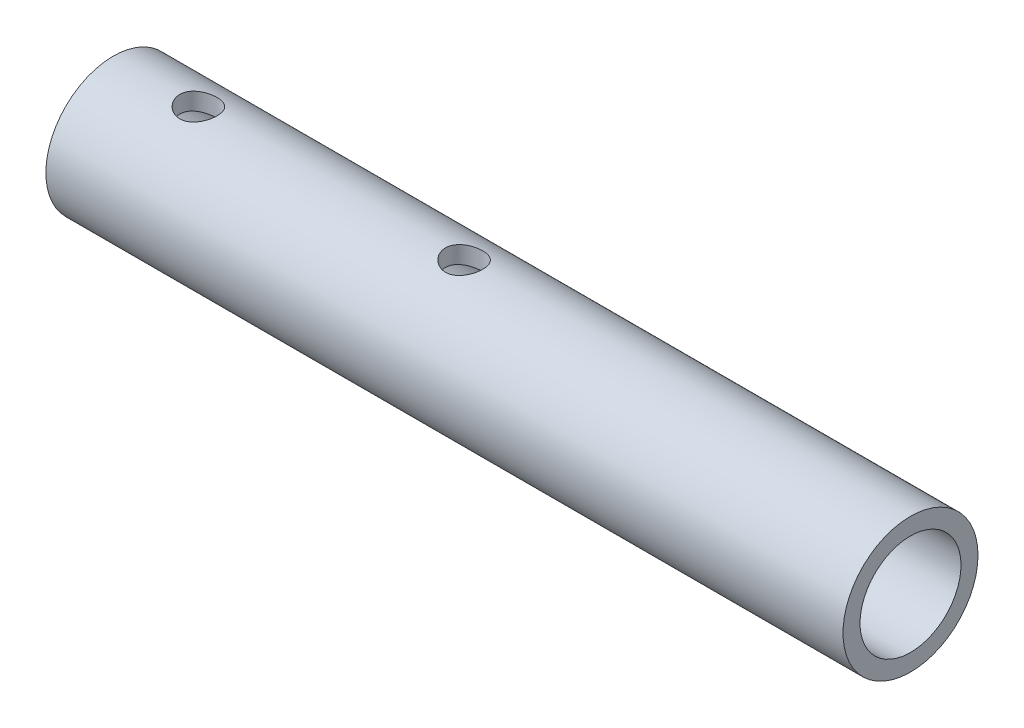
ISO-10303-21;
HEADER;
FILE_DESCRIPTION(('STEP AP214'),'2;1');
FILE_NAME('part.step','',(''),(''),'','','');
FILE_SCHEMA(('AUTOMOTIVE_DESIGN { 1 0 10303 214 1 1 1 1 }'));
ENDSEC;
DATA;
#1=APPLICATION_CONTEXT('core data for automotive mechanical design processes');
#2=APPLICATION_PROTOCOL_DEFINITION('international standard','automotive_design',2000,#1);
#3=PRODUCT_CONTEXT('',#1,'mechanical');
#4=PRODUCT('Part','Part','',(#3));
#5=PRODUCT_RELATED_PRODUCT_CATEGORY('part','',(#4));
#6=PRODUCT_DEFINITION_FORMATION('','',#4);
#7=PRODUCT_DEFINITION_CONTEXT('part definition',#1,'design');
#8=PRODUCT_DEFINITION('design','',#6,#7);
#9=PRODUCT_DEFINITION_SHAPE('','',#8);
#10=(LENGTH_UNIT() NAMED_UNIT(*) SI_UNIT(.MILLI.,.METRE.));
#11=(NAMED_UNIT(*) PLANE_ANGLE_UNIT() SI_UNIT($,.RADIAN.));
#12=(NAMED_UNIT(*) SI_UNIT($,.STERADIAN.) SOLID_ANGLE_UNIT());
#13=UNCERTAINTY_MEASURE_WITH_UNIT(LENGTH_MEASURE(1.E-05),#10,'distance_accuracy_value','');
#14=(GEOMETRIC_REPRESENTATION_CONTEXT(3) GLOBAL_UNCERTAINTY_ASSIGNED_CONTEXT((#13)) GLOBAL_UNIT_ASSIGNED_CONTEXT((#10,
#11,#12)) REPRESENTATION_CONTEXT('',''));
#15=CARTESIAN_POINT('',(0.,0.,0.));
#16=DIRECTION('',(0.,0.,1.));
#17=DIRECTION('',(1.,0.,0.));
#18=AXIS2_PLACEMENT_3D('',#15,#16,#17);
#19=CARTESIAN_POINT('',(75.,0.,0.));
#20=DIRECTION('',(1.,0.,0.));
#21=DIRECTION('',(0.,0.,-1.));
#22=AXIS2_PLACEMENT_3D('',#19,#20,#21);
#23=PLANE('',#22);
#24=CARTESIAN_POINT('',(75.,0.,0.));
#25=DIRECTION('',(1.,0.,0.));
#26=DIRECTION('',(0.,0.,-1.));
#27=AXIS2_PLACEMENT_3D('',#24,#25,#26);
#28=CIRCLE('',#27,6.35);
#29=CARTESIAN_POINT('',(75.,0.,-6.35000000000001));
#30=VERTEX_POINT('',#29);
#31=EDGE_CURVE('E10',#30,#30,#28,.T.);
#32=ORIENTED_EDGE('',*,*,#31,.T.);
#33=EDGE_LOOP('',(#32));
#34=FACE_BOUND('',#33,.T.);
#35=CARTESIAN_POINT('',(75.,0.,0.));
#36=DIRECTION('',(1.,0.,0.));
#37=DIRECTION('',(0.,0.,-1.));
#38=AXIS2_PLACEMENT_3D('',#35,#36,#37);
#39=CIRCLE('',#38,4.75);
#40=CARTESIAN_POINT('',(75.,0.,-4.75));
#41=VERTEX_POINT('',#40);
#42=EDGE_CURVE('E57',#41,#41,#39,.T.);
#43=ORIENTED_EDGE('',*,*,#42,.F.);
#44=EDGE_LOOP('',(#43));
#45=FACE_BOUND('',#44,.T.);
#46=ADVANCED_FACE('F41',(#34,#45),#23,.T.);
#47=CARTESIAN_POINT('',(0.,0.,0.));
#48=DIRECTION('',(1.,0.,0.));
#49=DIRECTION('',(0.,0.,-1.));
#50=AXIS2_PLACEMENT_3D('',#47,#48,#49);
#51=PLANE('',#50);
#52=CARTESIAN_POINT('',(0.,0.,0.));
#53=DIRECTION('',(1.,0.,0.));
#54=DIRECTION('',(0.,0.,-1.));
#55=AXIS2_PLACEMENT_3D('',#52,#53,#54);
#56=CIRCLE('',#55,6.35);
#57=CARTESIAN_POINT('',(0.,0.,-6.35000000000001));
#58=VERTEX_POINT('',#57);
#59=EDGE_CURVE('E46',#58,#58,#56,.T.);
#60=ORIENTED_EDGE('',*,*,#59,.F.);
#61=EDGE_LOOP('',(#60));
#62=FACE_BOUND('',#61,.T.);
#63=CARTESIAN_POINT('',(0.,0.,0.));
#64=DIRECTION('',(1.,0.,0.));
#65=DIRECTION('',(0.,0.,-1.));
#66=AXIS2_PLACEMENT_3D('',#63,#64,#65);
#67=CIRCLE('',#66,4.75);
#68=CARTESIAN_POINT('',(0.,0.,-4.75));
#69=VERTEX_POINT('',#68);
#70=EDGE_CURVE('E59',#69,#69,#67,.T.);
#71=ORIENTED_EDGE('',*,*,#70,.T.);
#72=EDGE_LOOP('',(#71));
#73=FACE_BOUND('',#72,.T.);
#74=ADVANCED_FACE('F94',(#62,#73),#51,.F.);
#75=CARTESIAN_POINT('',(75.,0.,0.));
#76=DIRECTION('',(-1.,0.,0.));
#77=DIRECTION('',(0.,0.,1.));
#78=AXIS2_PLACEMENT_3D('',#75,#76,#77);
#79=CYLINDRICAL_SURFACE('',#78,6.35);
#80=CARTESIAN_POINT('',(33.,6.10409698481276,1.75000000000001));
#81=CARTESIAN_POINT('',(32.903726478293,6.10409852189518,1.74999793665342));
#82=CARTESIAN_POINT('',(32.8074316060573,6.10639952563711,1.74202843331518));
#83=CARTESIAN_POINT('',(32.617631683193,6.11532507468688,1.71042689381995));
#84=CARTESIAN_POINT('',(32.5241279295562,6.121951598274,1.6867876910392));
#85=CARTESIAN_POINT('',(32.3426837176868,6.1387219498062,1.62468995100829));
#86=CARTESIAN_POINT('',(32.2547352945834,6.14886060043192,1.58625321795287));
#87=CARTESIAN_POINT('',(32.0865192465432,6.17150613503344,1.49572074421094));
#88=CARTESIAN_POINT('',(32.0062523664603,6.18401324832167,1.44362368075554));
#89=CARTESIAN_POINT('',(31.8535340796171,6.21036089584916,1.32576094494732));
#90=CARTESIAN_POINT('',(31.7813182217827,6.2242263372627,1.25969556769557));
#91=CARTESIAN_POINT('',(31.6488382082894,6.25151396033315,1.11641554637069));
#92=CARTESIAN_POINT('',(31.5885753639193,6.26493609322304,1.03919968065257));
#93=CARTESIAN_POINT('',(31.4807193949046,6.29010401576661,0.874166333287331));
#94=CARTESIAN_POINT('',(31.4333619873363,6.30181700590168,0.786189363698174));
#95=CARTESIAN_POINT('',(31.3542010867142,6.32196020254954,0.603144648889981));
#96=CARTESIAN_POINT('',(31.3223947850881,6.33039100177892,0.508078187629611));
#97=CARTESIAN_POINT('',(31.2760057043632,6.34284374916729,0.316013263798663));
#98=CARTESIAN_POINT('',(31.2610218764658,6.34696818532804,0.219118428085025));
#99=CARTESIAN_POINT('',(31.2474396764738,6.35070249588322,0.0241083672969177));
#100=CARTESIAN_POINT('',(31.2488383825844,6.35031317529801,-0.0740066370447175));
#101=CARTESIAN_POINT('',(31.2677025140013,6.34513825392006,-0.265874811958899));
#102=CARTESIAN_POINT('',(31.2847343961207,6.34047128681543,-0.359674299718142));
#103=CARTESIAN_POINT('',(31.3336790080619,6.3274065112384,-0.543028361863702));
#104=CARTESIAN_POINT('',(31.3655926141211,6.31900848308215,-0.632582685952297));
#105=CARTESIAN_POINT('',(31.4437169034401,6.29925232107458,-0.805991347951752));
#106=CARTESIAN_POINT('',(31.4900729559153,6.28786428361089,-0.889776646916401));
#107=CARTESIAN_POINT('',(31.5956538750467,6.26335032324547,-1.04852464490997));
#108=CARTESIAN_POINT('',(31.6548813958865,6.25022404212459,-1.12348551936064));
#109=CARTESIAN_POINT('',(31.7868122429779,6.22314469579829,-1.26504502601596));
#110=CARTESIAN_POINT('',(31.8598931643115,6.20917863144767,-1.33128968814417));
#111=CARTESIAN_POINT('',(32.0162698494247,6.18237831460548,-1.4506730103525));
#112=CARTESIAN_POINT('',(32.0995663262577,6.16954414122834,-1.50381075477976));
#113=CARTESIAN_POINT('',(32.2748188698337,6.14640581472612,-1.59576614174717));
#114=CARTESIAN_POINT('',(32.3668312778072,6.13611993035961,-1.63448133042054));
#115=CARTESIAN_POINT('',(32.5564144719339,6.11946654023644,-1.69577395826584));
#116=CARTESIAN_POINT('',(32.6539837633246,6.11309798613388,-1.71835571528702));
#117=CARTESIAN_POINT('',(32.8485853896213,6.10522544847568,-1.74611719743667));
#118=CARTESIAN_POINT('',(32.9455361088604,6.10357319211524,-1.75182754176751));
#119=CARTESIAN_POINT('',(33.1390083844814,6.10491351880639,-1.74715119911437));
#120=CARTESIAN_POINT('',(33.2355299888302,6.10790556891763,-1.73676635907443));
#121=CARTESIAN_POINT('',(33.4233172209264,6.11805354544699,-1.70066353208123));
#122=CARTESIAN_POINT('',(33.5146505149019,6.12512121731996,-1.67527025945891));
#123=CARTESIAN_POINT('',(33.6917600138364,6.14253652049985,-1.61023938700767));
#124=CARTESIAN_POINT('',(33.777535455364,6.15288460126118,-1.57059983517219));
#125=CARTESIAN_POINT('',(33.943298523538,6.17599473084397,-1.4771428108839));
#126=CARTESIAN_POINT('',(34.0231050430238,6.18880734492622,-1.42301691060488));
#127=CARTESIAN_POINT('',(34.1726973354878,6.21528665997305,-1.30250174020575));
#128=CARTESIAN_POINT('',(34.242481086923,6.2289535324418,-1.23611000228319));
#129=CARTESIAN_POINT('',(34.3722797338644,6.25611634637962,-1.09048291702272));
#130=CARTESIAN_POINT('',(34.4319229757604,6.26959372806886,-1.01091213415891));
#131=CARTESIAN_POINT('',(34.5370090491879,6.29442463276488,-0.842582573547962));
#132=CARTESIAN_POINT('',(34.5824526347714,6.30577826853723,-0.753824284023257));
#133=CARTESIAN_POINT('',(34.6574231405609,6.32500931795128,-0.570262414232425));
#134=CARTESIAN_POINT('',(34.6870701281453,6.33291286947596,-0.475510744283153));
#135=CARTESIAN_POINT('',(34.7299458903706,6.34446850347245,-0.282118143585694));
#136=CARTESIAN_POINT('',(34.7431785710197,6.34812159738577,-0.18347814388533));
#137=CARTESIAN_POINT('',(34.7525916563279,6.35071336069495,0.0114291341010378));
#138=CARTESIAN_POINT('',(34.7493155150718,6.34980228396121,0.10766852706502));
#139=CARTESIAN_POINT('',(34.7270753846226,6.34371155924545,0.298171727945037));
#140=CARTESIAN_POINT('',(34.7081120574102,6.33853209138451,0.392435619052808));
#141=CARTESIAN_POINT('',(34.6553512862475,6.32451989199523,0.57561130431485));
#142=CARTESIAN_POINT('',(34.6216707150383,6.31571597422642,0.664559113120028));
#143=CARTESIAN_POINT('',(34.5405355213958,6.29537233269626,0.83559145242125));
#144=CARTESIAN_POINT('',(34.4930788698193,6.28383220595181,0.917674969547773));
#145=CARTESIAN_POINT('',(34.3841853591656,6.25884086005361,1.07515156591088));
#146=CARTESIAN_POINT('',(34.3223930345162,6.24534504091406,1.15029173595953));
#147=CARTESIAN_POINT('',(34.1872475344186,6.21813343781277,1.28931975281782));
#148=CARTESIAN_POINT('',(34.1138912515663,6.20441759562002,1.35320456534951));
#149=CARTESIAN_POINT('',(33.9555890873447,6.1779386391802,1.46942833080971));
#150=CARTESIAN_POINT('',(33.8704078535544,6.16520618208944,1.52145437107517));
#151=CARTESIAN_POINT('',(33.6921670311141,6.14258160774524,1.61037572384607));
#152=CARTESIAN_POINT('',(33.5991123007624,6.13268775525964,1.6472802860082));
#153=CARTESIAN_POINT('',(33.4220930648615,6.11813511573822,1.70045924139317));
#154=CARTESIAN_POINT('',(33.3388465260888,6.11291516228686,1.71899156143149));
#155=CARTESIAN_POINT('',(33.1704053932083,6.10589564386316,1.74376203696688));
#156=CARTESIAN_POINT('',(33.0852110595032,6.10409562435124,1.75000182625448));
#157=CARTESIAN_POINT('',(33.,6.10409698481276,1.75000000000001));
#158=B_SPLINE_CURVE_WITH_KNOTS('',3,(#80,#81,#82,#83,#84,#85,#86,#87,#88,#89,#90,#91,#92,#93,
#94,#95,#96,#97,#98,#99,#100,#101,#102,#103,#104,#105,#106,#107,#108,#109,#110,#111,#112,#113,
#114,#115,#116,#117,#118,#119,#120,#121,#122,#123,#124,#125,#126,#127,#128,#129,#130,#131,#132,
#133,#134,#135,#136,#137,#138,#139,#140,#141,#142,#143,#144,#145,#146,#147,#148,#149,#150,#151,
#152,#153,#154,#155,#156,#157),.UNSPECIFIED.,.T.,.F.,(4,2,2,2,2,2,2,2,2,2,2,2,2,2,2,2,2,2,2,2,2,
2,2,2,2,2,2,2,2,2,2,2,2,2,2,2,2,2,4),(0.,0.2885069858017,0.577146012995166,0.865361347783308,
1.15360460160036,1.44880872771764,1.74404522090432,2.04435917572703,2.34461887297435,
2.63755738646942,2.93044365571319,3.21544518194925,3.5004634912202,3.78844873778186,
4.07649342528813,4.37396520397803,4.67145775824561,4.97102504598991,5.27051212938253,
5.56047420737574,5.85040301429398,6.13427754321484,6.41819098309071,6.7087104475818,
6.99928842637667,7.29891051854349,7.59851669701259,7.89581190287579,8.19303634971137,
8.48054166303009,8.76803484458378,9.05328533417214,9.33857786097758,9.63188947804368,
9.92528004699316,10.2256921942077,10.5259203070039,10.781309884442,11.0366655159628),.UNSPECIFIED.);
#159=CARTESIAN_POINT('',(33.,6.10409698481276,1.75000000000001));
#160=VERTEX_POINT('',#159);
#161=EDGE_CURVE('E111',#160,#160,#158,.T.);
#162=ORIENTED_EDGE('',*,*,#161,.T.);
#163=EDGE_LOOP('',(#162));
#164=FACE_BOUND('',#163,.T.);
#165=CARTESIAN_POINT('',(8.00000000000001,6.10409698481277,1.75000000000001));
#166=CARTESIAN_POINT('',(7.90372647829301,6.10409852189518,1.74999793665341));
#167=CARTESIAN_POINT('',(7.80743160605726,6.1063995256371,1.74202843331517));
#168=CARTESIAN_POINT('',(7.61763168319297,6.11532507468688,1.71042689381994));
#169=CARTESIAN_POINT('',(7.52412792955616,6.12195159827402,1.68678769103919));
#170=CARTESIAN_POINT('',(7.34268371768681,6.13872194980622,1.62468995100828));
#171=CARTESIAN_POINT('',(7.2547352945834,6.14886060043191,1.58625321795286));
#172=CARTESIAN_POINT('',(7.08651924654331,6.17150613503343,1.49572074421096));
#173=CARTESIAN_POINT('',(7.0062523664604,6.18401324832167,1.44362368075558));
#174=CARTESIAN_POINT('',(6.85353407961716,6.21036089584917,1.32576094494737));
#175=CARTESIAN_POINT('',(6.78131822178277,6.22422633726269,1.2596955676956));
#176=CARTESIAN_POINT('',(6.64883820828944,6.25151396033313,1.11641554637071));
#177=CARTESIAN_POINT('',(6.58857536391925,6.26493609322303,1.03919968065262));
#178=CARTESIAN_POINT('',(6.4807193949046,6.29010401576661,0.874166333287401));
#179=CARTESIAN_POINT('',(6.43336198733634,6.30181700590169,0.786189363698244));
#180=CARTESIAN_POINT('',(6.35420108671434,6.32196020254951,0.603144648890037));
#181=CARTESIAN_POINT('',(6.32239478508829,6.33039100177884,0.50807818762965));
#182=CARTESIAN_POINT('',(6.27600570436338,6.34284374916721,0.316013263798687));
#183=CARTESIAN_POINT('',(6.26102187646585,6.34696818532801,0.219118428085048));
#184=CARTESIAN_POINT('',(6.24743967647382,6.35070249588323,0.0241083672969252));
#185=CARTESIAN_POINT('',(6.2488383825844,6.35031317529803,-0.074006637044725));
#186=CARTESIAN_POINT('',(6.26770251400133,6.34513825392006,-0.265874811958916));
#187=CARTESIAN_POINT('',(6.28473439612067,6.34047128681541,-0.359674299718155));
#188=CARTESIAN_POINT('',(6.33367900806193,6.32740651123841,-0.543028361863722));
#189=CARTESIAN_POINT('',(6.36559261412111,6.31900848308222,-0.63258268595233));
#190=CARTESIAN_POINT('',(6.44371690344011,6.29925232107465,-0.805991347951779));
#191=CARTESIAN_POINT('',(6.4900729559154,6.28786428361089,-0.889776646916411));
#192=CARTESIAN_POINT('',(6.59565387504673,6.26335032324546,-1.04852464490997));
#193=CARTESIAN_POINT('',(6.65488139588645,6.25022404212461,-1.12348551936065));
#194=CARTESIAN_POINT('',(6.78681224297786,6.22314469579833,-1.26504502601595));
#195=CARTESIAN_POINT('',(6.85989316431144,6.20917863144766,-1.33128968814415));
#196=CARTESIAN_POINT('',(7.01626984942474,6.18237831460547,-1.45067301035248));
#197=CARTESIAN_POINT('',(7.09956632625769,6.16954414122837,-1.50381075477975));
#198=CARTESIAN_POINT('',(7.27481886983369,6.14640581472616,-1.59576614174718));
#199=CARTESIAN_POINT('',(7.36683127780725,6.1361199303596,-1.63448133042056));
#200=CARTESIAN_POINT('',(7.55641447193397,6.11946654023643,-1.69577395826582));
#201=CARTESIAN_POINT('',(7.65398376332465,6.1130979861339,-1.71835571528696));
#202=CARTESIAN_POINT('',(7.84858538962133,6.1052254484757,-1.74611719743662));
#203=CARTESIAN_POINT('',(7.94553610886044,6.10357319211525,-1.75182754176751));
#204=CARTESIAN_POINT('',(8.13900838448143,6.10491351880637,-1.74715119911436));
#205=CARTESIAN_POINT('',(8.23552998883024,6.1079055689176,-1.73676635907437));
#206=CARTESIAN_POINT('',(8.42331722092642,6.11805354544697,-1.70066353208116));
#207=CARTESIAN_POINT('',(8.51465051490193,6.12512121731996,-1.67527025945887));
#208=CARTESIAN_POINT('',(8.69176001383654,6.14253652049986,-1.61023938700765));
#209=CARTESIAN_POINT('',(8.77753545536409,6.15288460126117,-1.57059983517216));
#210=CARTESIAN_POINT('',(8.94329852353809,6.17599473084396,-1.47714281088387));
#211=CARTESIAN_POINT('',(9.02310504302389,6.18880734492622,-1.42301691060486));
#212=CARTESIAN_POINT('',(9.17269733548783,6.21528665997304,-1.30250174020573));
#213=CARTESIAN_POINT('',(9.24248108692303,6.22895353244175,-1.23611000228315));
#214=CARTESIAN_POINT('',(9.37227973386442,6.25611634637956,-1.09048291702268));
#215=CARTESIAN_POINT('',(9.43192297576042,6.26959372806883,-1.0109121341589));
#216=CARTESIAN_POINT('',(9.53700904918795,6.29442463276489,-0.842582573547969));
#217=CARTESIAN_POINT('',(9.58245263477143,6.30577826853723,-0.753824284023256));
#218=CARTESIAN_POINT('',(9.65742314056088,6.32500931795128,-0.570262414232425));
#219=CARTESIAN_POINT('',(9.68707012814531,6.33291286947595,-0.475510744283163));
#220=CARTESIAN_POINT('',(9.72994589037066,6.34446850347244,-0.282118143585715));
#221=CARTESIAN_POINT('',(9.74317857101969,6.34812159738577,-0.183478143885351));
#222=CARTESIAN_POINT('',(9.75259165632789,6.35071336069495,0.0114291341010138));
#223=CARTESIAN_POINT('',(9.74931551507182,6.3498022839612,0.107668527064995));
#224=CARTESIAN_POINT('',(9.72707538462263,6.34371155924544,0.298171727945011));
#225=CARTESIAN_POINT('',(9.7081120574102,6.33853209138452,0.392435619052785));
#226=CARTESIAN_POINT('',(9.65535128624758,6.32451989199525,0.575611304314837));
#227=CARTESIAN_POINT('',(9.6216707150383,6.31571597422641,0.664559113120023));
#228=CARTESIAN_POINT('',(9.54053552139581,6.29537233269625,0.835591452421258));
#229=CARTESIAN_POINT('',(9.49307886981926,6.28383220595181,0.917674969547785));
#230=CARTESIAN_POINT('',(9.38418535916558,6.2588408600536,1.0751515659109));
#231=CARTESIAN_POINT('',(9.32239303451615,6.24534504091404,1.15029173595956));
#232=CARTESIAN_POINT('',(9.1872475344186,6.21813343781276,1.28931975281785));
#233=CARTESIAN_POINT('',(9.1138912515663,6.20441759562006,1.35320456534952));
#234=CARTESIAN_POINT('',(8.95558908734472,6.17793863918025,1.46942833080971));
#235=CARTESIAN_POINT('',(8.87040785355441,6.16520618208945,1.52145437107519));
#236=CARTESIAN_POINT('',(8.69216703111406,6.14258160774521,1.61037572384607));
#237=CARTESIAN_POINT('',(8.59911230076239,6.1326877552596,1.64728028600818));
#238=CARTESIAN_POINT('',(8.4220930648615,6.11813511573819,1.70045924139315));
#239=CARTESIAN_POINT('',(8.33884652608879,6.11291516228684,1.71899156143149));
#240=CARTESIAN_POINT('',(8.17040539320827,6.10589564386316,1.74376203696688));
#241=CARTESIAN_POINT('',(8.08521105950315,6.10409562435125,1.75000182625448));
#242=CARTESIAN_POINT('',(8.00000000000001,6.10409698481277,1.75000000000001));
#243=B_SPLINE_CURVE_WITH_KNOTS('',3,(#165,#166,#167,#168,#169,#170,#171,#172,#173,#174,#175,
#176,#177,#178,#179,#180,#181,#182,#183,#184,#185,#186,#187,#188,#189,#190,#191,#192,#193,#194,
#195,#196,#197,#198,#199,#200,#201,#202,#203,#204,#205,#206,#207,#208,#209,#210,#211,#212,#213,
#214,#215,#216,#217,#218,#219,#220,#221,#222,#223,#224,#225,#226,#227,#228,#229,#230,#231,#232,
#233,#234,#235,#236,#237,#238,#239,#240,#241,#242),.UNSPECIFIED.,.T.,.F.,(4,2,2,2,2,2,2,2,2,2,2,
2,2,2,2,2,2,2,2,2,2,2,2,2,2,2,2,2,2,2,2,2,2,2,2,2,2,2,4),(0.,0.288506985801706,
0.577146012995171,0.865361347783244,1.15360460160024,1.44880872771756,1.74404522090427,
2.04435917572693,2.34461887297423,2.63755738646936,2.93044365571316,3.21544518194922,
3.5004634912202,3.78844873778182,4.07649342528804,4.37396520397796,4.67145775824557,
4.97102504598988,5.27051212938251,5.56047420737573,5.85040301429397,6.13427754321485,
6.41819098309074,6.70871044758178,6.9992884263766,7.29891051854343,7.59851669701251,
7.8958119028757,8.19303634971128,8.48054166302999,8.76803484458367,9.05328533417207,
9.33857786097756,9.63188947804364,9.92528004699311,10.2256921942077,10.5259203070039,
10.7813098844419,11.0366655159627),.UNSPECIFIED.);
#244=CARTESIAN_POINT('',(8.00000000000001,6.10409698481277,1.75000000000001));
#245=VERTEX_POINT('',#244);
#246=EDGE_CURVE('E63',#245,#245,#243,.T.);
#247=ORIENTED_EDGE('',*,*,#246,.T.);
#248=EDGE_LOOP('',(#247));
#249=FACE_BOUND('',#248,.T.);
#250=ORIENTED_EDGE('',*,*,#31,.F.);
#251=EDGE_LOOP('',(#250));
#252=FACE_BOUND('',#251,.T.);
#253=ORIENTED_EDGE('',*,*,#59,.T.);
#254=EDGE_LOOP('',(#253));
#255=FACE_BOUND('',#254,.T.);
#256=ADVANCED_FACE('F43',(#164,#249,#252,#255),#79,.T.);
#257=CARTESIAN_POINT('',(75.,0.,0.));
#258=DIRECTION('',(-1.,0.,0.));
#259=DIRECTION('',(0.,0.,1.));
#260=AXIS2_PLACEMENT_3D('',#257,#258,#259);
#261=CYLINDRICAL_SURFACE('',#260,4.75);
#262=CARTESIAN_POINT('',(33.,4.41588043316392,1.75000000000001));
#263=CARTESIAN_POINT('',(33.094643704677,4.41587772594442,1.75000296393606));
#264=CARTESIAN_POINT('',(33.1892674735245,4.41895619841335,1.74229659111619));
#265=CARTESIAN_POINT('',(33.3756701626302,4.43085479011937,1.71180900473027));
#266=CARTESIAN_POINT('',(33.4674490875959,4.43967489985515,1.68902781611015));
#267=CARTESIAN_POINT('',(33.6454209864375,4.46192494737435,1.62933325783482));
#268=CARTESIAN_POINT('',(33.7316263900987,4.4753441749924,1.59245269915774));
#269=CARTESIAN_POINT('',(33.8966591662716,4.50526347974244,1.50572194894059));
#270=CARTESIAN_POINT('',(33.9754843986707,4.52176444639289,1.45586801110351));
#271=CARTESIAN_POINT('',(34.1272982749308,4.55687446049117,1.34204573923531));
#272=CARTESIAN_POINT('',(34.1998828145986,4.57554404127524,1.27755695287522));
#273=CARTESIAN_POINT('',(34.3334901386671,4.61238165049267,1.13740091022651));
#274=CARTESIAN_POINT('',(34.3945105654326,4.63054957600739,1.06173138004647));
#275=CARTESIAN_POINT('',(34.5051852210974,4.66505327690858,0.898313025326076));
#276=CARTESIAN_POINT('',(34.5544028062826,4.68130976917125,0.810250250338094));
#277=CARTESIAN_POINT('',(34.6371584176023,4.7094337079724,0.626390609541288));
#278=CARTESIAN_POINT('',(34.6707016783666,4.72130261951942,0.530596338310458));
#279=CARTESIAN_POINT('',(34.7197469784455,4.73888454693962,0.3382395778143));
#280=CARTESIAN_POINT('',(34.7359441571717,4.74483401415565,0.241876359414172));
#281=CARTESIAN_POINT('',(34.7520620258188,4.75075375782532,0.0476281685466092));
#282=CARTESIAN_POINT('',(34.7519878250426,4.75072591118856,-0.0502563165810003));
#283=CARTESIAN_POINT('',(34.7359758419837,4.74484620389748,-0.239796265876197));
#284=CARTESIAN_POINT('',(34.720796170855,4.73927267080137,-0.331525893364509));
#285=CARTESIAN_POINT('',(34.6762758239679,4.72329030859975,-0.511030847963088));
#286=CARTESIAN_POINT('',(34.6469341498645,4.71288113860978,-0.598805895819734));
#287=CARTESIAN_POINT('',(34.5745561630335,4.68807624444386,-0.7694053447307));
#288=CARTESIAN_POINT('',(34.5313291007294,4.67362537818711,-0.85214047007091));
#289=CARTESIAN_POINT('',(34.4325741061395,4.64220642699347,-1.0093851902985));
#290=CARTESIAN_POINT('',(34.3770422837008,4.62523754654742,-1.08389217266942));
#291=CARTESIAN_POINT('',(34.2515731181717,4.58940344009113,-1.22704019410143));
#292=CARTESIAN_POINT('',(34.1809978296398,4.57048524329972,-1.2951096651375));
#293=CARTESIAN_POINT('',(34.0293115808277,4.53366038900359,-1.41865751556405));
#294=CARTESIAN_POINT('',(33.9481981677339,4.51575396839269,-1.47413295533113));
#295=CARTESIAN_POINT('',(33.7755574336054,4.48265316721039,-1.57195807450836));
#296=CARTESIAN_POINT('',(33.6838488018777,4.46752284314863,-1.6140111879521));
#297=CARTESIAN_POINT('',(33.4939480024568,4.44242694807012,-1.681864219358));
#298=CARTESIAN_POINT('',(33.3957593229532,4.43245862352274,-1.70767280411619));
#299=CARTESIAN_POINT('',(33.2013174590567,4.41946049269838,-1.74102675881321));
#300=CARTESIAN_POINT('',(33.1052425297296,4.41608748505332,-1.74947671945547));
#301=CARTESIAN_POINT('',(32.9130092664112,4.41569224070595,-1.75047569083922));
#302=CARTESIAN_POINT('',(32.8168509576645,4.41866849505831,-1.74302847965155));
#303=CARTESIAN_POINT('',(32.6317300702696,4.4302888724583,-1.71326363345396));
#304=CARTESIAN_POINT('',(32.5426386742633,4.43867082898711,-1.69163309014842));
#305=CARTESIAN_POINT('',(32.3693864827957,4.45985091705362,-1.63497340037805));
#306=CARTESIAN_POINT('',(32.2852266799876,4.47264993412953,-1.59994156705177));
#307=CARTESIAN_POINT('',(32.1208014994071,4.50179918472839,-1.51602778156754));
#308=CARTESIAN_POINT('',(32.0407915673201,4.51826229259479,-1.46668564858571));
#309=CARTESIAN_POINT('',(31.8898648561892,4.55269040433568,-1.35604656800244));
#310=CARTESIAN_POINT('',(31.8189513186107,4.57065593984803,-1.2947453783445));
#311=CARTESIAN_POINT('',(31.6837602577161,4.60738492160968,-1.15751528786498));
#312=CARTESIAN_POINT('',(31.6201483764504,4.62613046593703,-1.08092361626653));
#313=CARTESIAN_POINT('',(31.5066065205978,4.66125546454762,-0.917691548906777));
#314=CARTESIAN_POINT('',(31.4566764810694,4.67763493006141,-0.831051200844865));
#315=CARTESIAN_POINT('',(31.3722727640303,4.70615763510813,-0.650312130432781));
#316=CARTESIAN_POINT('',(31.3377360556552,4.71831810388549,-0.556245714925111));
#317=CARTESIAN_POINT('',(31.285161495671,4.73709415356964,-0.363090491647545));
#318=CARTESIAN_POINT('',(31.2671161934978,4.7437122383273,-0.264003973259541));
#319=CARTESIAN_POINT('',(31.2488190038322,4.75042842188178,-0.069648715938656));
#320=CARTESIAN_POINT('',(31.2476199610682,4.75087356536522,0.0255196842809479));
#321=CARTESIAN_POINT('',(31.2606294447133,4.74609027643645,0.214642320081045));
#322=CARTESIAN_POINT('',(31.274836220713,4.74086248858274,0.308596692372172));
#323=CARTESIAN_POINT('',(31.3175935746866,4.72547440695464,0.490446312410128));
#324=CARTESIAN_POINT('',(31.3458084212073,4.71542974291821,0.57843102102063));
#325=CARTESIAN_POINT('',(31.415451002187,4.69145287166495,0.748429740032015));
#326=CARTESIAN_POINT('',(31.4568812322474,4.6775199302456,0.830442619112993));
#327=CARTESIAN_POINT('',(31.5537312028064,4.64645105067488,0.98988051852367));
#328=CARTESIAN_POINT('',(31.6096584867753,4.62920650786024,1.06697569431901));
#329=CARTESIAN_POINT('',(31.7331049043176,4.59364047116218,1.2109825161298));
#330=CARTESIAN_POINT('',(31.8006281143186,4.57531860004972,1.27789056530859));
#331=CARTESIAN_POINT('',(31.9494077499229,4.53853497553211,1.40309505510574));
#332=CARTESIAN_POINT('',(32.0311854973241,4.52011288230366,1.46078598729613));
#333=CARTESIAN_POINT('',(32.2038586143454,4.48627758721275,1.56161880229364));
#334=CARTESIAN_POINT('',(32.2947543284365,4.47086449909348,1.60476013515724));
#335=CARTESIAN_POINT('',(32.4859978711911,4.44465900248473,1.676008488497));
#336=CARTESIAN_POINT('',(32.5865430858467,4.43401318465434,1.70364441331098));
#337=CARTESIAN_POINT('',(32.7914017937357,4.41962745275239,1.74063307895359));
#338=CARTESIAN_POINT('',(32.8957129995382,4.4158834162234,1.74999673406699));
#339=CARTESIAN_POINT('',(33.,4.41588043316392,1.75000000000001));
#340=B_SPLINE_CURVE_WITH_KNOTS('',3,(#262,#263,#264,#265,#266,#267,#268,#269,#270,#271,#272,
#273,#274,#275,#276,#277,#278,#279,#280,#281,#282,#283,#284,#285,#286,#287,#288,#289,#290,#291,
#292,#293,#294,#295,#296,#297,#298,#299,#300,#301,#302,#303,#304,#305,#306,#307,#308,#309,#310,
#311,#312,#313,#314,#315,#316,#317,#318,#319,#320,#321,#322,#323,#324,#325,#326,#327,#328,#329,
#330,#331,#332,#333,#334,#335,#336,#337,#338,#339),.UNSPECIFIED.,.T.,.F.,(4,2,2,2,2,2,2,2,2,2,2,
2,2,2,2,2,2,2,2,2,2,2,2,2,2,2,2,2,2,2,2,2,2,2,2,2,2,2,4),(0.,0.28354312410987,0.567085779011282,
0.849972572572725,1.13294114561641,1.4282423684587,1.72360373126369,2.0286180348184,
2.33353040223502,2.62570494689435,2.91778774726543,3.1959152025583,3.47406226720564,
3.75620666411479,4.03844038863934,4.33666566867959,4.63496048727292,4.9394511253468,
5.24377917328466,5.53179858770447,5.8197495599752,6.09469008353301,6.3696857595865,
6.65475099785579,6.93991753749493,7.24242277391773,7.54492657445749,7.8461800743125,
8.14729740508207,8.43141245384541,8.71549522483433,8.99307613398452,9.27070949275213,
9.55982077145926,9.84903389306843,10.1528520880748,10.456681765468,10.7693020341684,
11.0817355131397),.UNSPECIFIED.);
#341=CARTESIAN_POINT('',(33.,4.41588043316392,1.75000000000001));
#342=VERTEX_POINT('',#341);
#343=EDGE_CURVE('E117',#342,#342,#340,.T.);
#344=ORIENTED_EDGE('',*,*,#343,.T.);
#345=EDGE_LOOP('',(#344));
#346=FACE_BOUND('',#345,.T.);
#347=CARTESIAN_POINT('',(7.99999999999984,4.41588043316392,1.75000000000001));
#348=CARTESIAN_POINT('',(8.09464370467686,4.41587772594442,1.75000296393607));
#349=CARTESIAN_POINT('',(8.18926747352433,4.41895619841334,1.74229659111622));
#350=CARTESIAN_POINT('',(8.37567016263006,4.43085479011935,1.71180900473029));
#351=CARTESIAN_POINT('',(8.46744908759573,4.43967489985513,1.68902781611016));
#352=CARTESIAN_POINT('',(8.6454209864374,4.46192494737434,1.62933325783482));
#353=CARTESIAN_POINT('',(8.73162639009861,4.4753441749924,1.59245269915775));
#354=CARTESIAN_POINT('',(8.89665916627164,4.50526347974242,1.5057219489406));
#355=CARTESIAN_POINT('',(8.97548439867084,4.52176444639286,1.45586801110352));
#356=CARTESIAN_POINT('',(9.12729827493089,4.55687446049114,1.3420457392353));
#357=CARTESIAN_POINT('',(9.19988281459866,4.57554404127523,1.27755695287519));
#358=CARTESIAN_POINT('',(9.3334901386671,4.61238165049268,1.13740091022646));
#359=CARTESIAN_POINT('',(9.39451056543262,4.6305495760074,1.06173138004642));
#360=CARTESIAN_POINT('',(9.50518522109744,4.66505327690859,0.898313025326042));
#361=CARTESIAN_POINT('',(9.55440280628268,4.68130976917125,0.810250250338058));
#362=CARTESIAN_POINT('',(9.63715841760231,4.7094337079724,0.626390609541255));
#363=CARTESIAN_POINT('',(9.67070167836659,4.72130261951942,0.530596338310432));
#364=CARTESIAN_POINT('',(9.71974697844554,4.73888454693963,0.338239577814296));
#365=CARTESIAN_POINT('',(9.73594415717174,4.74483401415567,0.241876359414185));
#366=CARTESIAN_POINT('',(9.75206202581878,4.75075375782529,0.047628168546658));
#367=CARTESIAN_POINT('',(9.7519878250426,4.75072591118847,-0.0502563165809313));
#368=CARTESIAN_POINT('',(9.73597584198373,4.74484620389741,-0.239796265876124));
#369=CARTESIAN_POINT('',(9.72079617085503,4.73927267080135,-0.331525893364451));
#370=CARTESIAN_POINT('',(9.67627582396792,4.72329030859976,-0.511030847963034));
#371=CARTESIAN_POINT('',(9.64693414986443,4.71288113860977,-0.598805895819667));
#372=CARTESIAN_POINT('',(9.5745561630335,4.68807624444384,-0.769405344730644));
#373=CARTESIAN_POINT('',(9.53132910072943,4.6736253781871,-0.852140470070878));
#374=CARTESIAN_POINT('',(9.43257410613959,4.64220642699347,-1.00938519029851));
#375=CARTESIAN_POINT('',(9.37704228370086,4.62523754654742,-1.08389217266944));
#376=CARTESIAN_POINT('',(9.25157311817177,4.58940344009113,-1.22704019410144));
#377=CARTESIAN_POINT('',(9.18099782963986,4.57048524329972,-1.29510966513747));
#378=CARTESIAN_POINT('',(9.02931158082777,4.53366038900359,-1.41865751556401));
#379=CARTESIAN_POINT('',(8.948198167734,4.51575396839271,-1.4741329553311));
#380=CARTESIAN_POINT('',(8.7755574336055,4.48265316721039,-1.57195807450834));
#381=CARTESIAN_POINT('',(8.68384880187775,4.46752284314861,-1.61401118795208));
#382=CARTESIAN_POINT('',(8.49394800245685,4.44242694807013,-1.681864219358));
#383=CARTESIAN_POINT('',(8.39575932295317,4.43245862352278,-1.70767280411621));
#384=CARTESIAN_POINT('',(8.20131745905672,4.41946049269842,-1.74102675881324));
#385=CARTESIAN_POINT('',(8.10524252972963,4.41608748505333,-1.74947671945549));
#386=CARTESIAN_POINT('',(7.91300926641122,4.41569224070593,-1.7504756908392));
#387=CARTESIAN_POINT('',(7.81685095766456,4.41866849505829,-1.7430284796515));
#388=CARTESIAN_POINT('',(7.63173007026968,4.43028887245828,-1.71326363345393));
#389=CARTESIAN_POINT('',(7.54263867426337,4.4386708289871,-1.69163309014843));
#390=CARTESIAN_POINT('',(7.3693864827958,4.45985091705362,-1.63497340037806));
#391=CARTESIAN_POINT('',(7.28522667998773,4.47264993412953,-1.59994156705173));
#392=CARTESIAN_POINT('',(7.12080149940714,4.50179918472839,-1.51602778156749));
#393=CARTESIAN_POINT('',(7.04079156732019,4.51826229259479,-1.4666856485857));
#394=CARTESIAN_POINT('',(6.88986485618925,4.55269040433567,-1.35604656800245));
#395=CARTESIAN_POINT('',(6.81895131861067,4.57065593984802,-1.29474537834448));
#396=CARTESIAN_POINT('',(6.68376025771613,4.60738492160968,-1.15751528786495));
#397=CARTESIAN_POINT('',(6.62014837645036,4.62613046593705,-1.08092361626651));
#398=CARTESIAN_POINT('',(6.50660652059781,4.66125546454761,-0.917691548906737));
#399=CARTESIAN_POINT('',(6.4566764810694,4.67763493006135,-0.831051200844799));
#400=CARTESIAN_POINT('',(6.37227276403035,4.70615763510806,-0.650312130432699));
#401=CARTESIAN_POINT('',(6.33773605565518,4.71831810388547,-0.556245714925039));
#402=CARTESIAN_POINT('',(6.285161495671,4.73709415356967,-0.363090491647488));
#403=CARTESIAN_POINT('',(6.26711619349785,4.74371223832734,-0.264003973259488));
#404=CARTESIAN_POINT('',(6.24881900383221,4.75042842188181,-0.0696487159386136));
#405=CARTESIAN_POINT('',(6.24761996106824,4.75087356536522,0.0255196842809839));
#406=CARTESIAN_POINT('',(6.26062944471334,4.74609027643642,0.214642320081072));
#407=CARTESIAN_POINT('',(6.27483622071302,4.7408624885827,0.308596692372196));
#408=CARTESIAN_POINT('',(6.3175935746866,4.72547440695461,0.490446312410137));
#409=CARTESIAN_POINT('',(6.34580842120731,4.71542974291819,0.578431021020628));
#410=CARTESIAN_POINT('',(6.415451002187,4.69145287166497,0.748429740032005));
#411=CARTESIAN_POINT('',(6.45688123224734,4.67751993024563,0.830442619112985));
#412=CARTESIAN_POINT('',(6.55373120280633,4.64645105067491,0.989880518523667));
#413=CARTESIAN_POINT('',(6.60965848677526,4.62920650786025,1.06697569431901));
#414=CARTESIAN_POINT('',(6.73310490431766,4.59364047116216,1.21098251612981));
#415=CARTESIAN_POINT('',(6.80062811431869,4.57531860004969,1.27789056530862));
#416=CARTESIAN_POINT('',(6.94940774992302,4.53853497553209,1.40309505510578));
#417=CARTESIAN_POINT('',(7.03118549732418,4.52011288230365,1.46078598729617));
#418=CARTESIAN_POINT('',(7.20385861434543,4.48627758721273,1.56161880229365));
#419=CARTESIAN_POINT('',(7.2947543284366,4.47086449909345,1.60476013515722));
#420=CARTESIAN_POINT('',(7.48599787119108,4.4446590024847,1.67600848849696));
#421=CARTESIAN_POINT('',(7.58654308584672,4.43401318465433,1.70364441331095));
#422=CARTESIAN_POINT('',(7.79140179373561,4.41962745275241,1.74063307895358));
#423=CARTESIAN_POINT('',(7.89571299953811,4.41588341622341,1.74999673406698));
#424=CARTESIAN_POINT('',(7.99999999999984,4.41588043316392,1.75000000000001));
#425=B_SPLINE_CURVE_WITH_KNOTS('',3,(#347,#348,#349,#350,#351,#352,#353,#354,#355,#356,#357,
#358,#359,#360,#361,#362,#363,#364,#365,#366,#367,#368,#369,#370,#371,#372,#373,#374,#375,#376,
#377,#378,#379,#380,#381,#382,#383,#384,#385,#386,#387,#388,#389,#390,#391,#392,#393,#394,#395,
#396,#397,#398,#399,#400,#401,#402,#403,#404,#405,#406,#407,#408,#409,#410,#411,#412,#413,#414,
#415,#416,#417,#418,#419,#420,#421,#422,#423,#424),.UNSPECIFIED.,.T.,.F.,(4,2,2,2,2,2,2,2,2,2,2,
2,2,2,2,2,2,2,2,2,2,2,2,2,2,2,2,2,2,2,2,2,2,2,2,2,2,2,4),(0.,0.283543124109874,
0.567085779011297,0.849972572572874,1.13294114561668,1.42824236845894,1.72360373126391,
2.02861803481862,2.33353040223522,2.62570494689449,2.91778774726552,3.19591520255841,
3.47406226720576,3.75620666411494,4.03844038863948,4.3366656686797,4.63496048727301,
4.93945112534696,5.24377917328485,5.53179858770462,5.81974955997531,6.09469008353312,
6.36968575958661,6.65475099785593,6.9399175374951,7.24242277391791,7.54492657445769,
7.8461800743127,8.14729740508226,8.43141245384557,8.71549522483449,8.99307613398464,
9.27070949275221,9.5598207714594,9.84903389306865,10.152852088075,10.4566817654681,
10.7693020341684,11.0817355131397),.UNSPECIFIED.);
#426=CARTESIAN_POINT('',(7.99999999999984,4.41588043316392,1.75000000000001));
#427=VERTEX_POINT('',#426);
#428=EDGE_CURVE('E74',#427,#427,#425,.T.);
#429=ORIENTED_EDGE('',*,*,#428,.T.);
#430=EDGE_LOOP('',(#429));
#431=FACE_BOUND('',#430,.T.);
#432=ORIENTED_EDGE('',*,*,#42,.T.);
#433=EDGE_LOOP('',(#432));
#434=FACE_BOUND('',#433,.T.);
#435=ORIENTED_EDGE('',*,*,#70,.F.);
#436=EDGE_LOOP('',(#435));
#437=FACE_BOUND('',#436,.T.);
#438=ADVANCED_FACE('F85',(#346,#431,#434,#437),#261,.F.);
#439=CARTESIAN_POINT('',(7.99999999999998,-6.35099999999995,0.));
#440=DIRECTION('',(0.,1.,0.));
#441=DIRECTION('',(0.,0.,1.));
#442=AXIS2_PLACEMENT_3D('',#439,#440,#441);
#443=CYLINDRICAL_SURFACE('',#442,1.75);
#444=ORIENTED_EDGE('',*,*,#428,.F.);
#445=EDGE_LOOP('',(#444));
#446=FACE_BOUND('',#445,.T.);
#447=ORIENTED_EDGE('',*,*,#246,.F.);
#448=EDGE_LOOP('',(#447));
#449=FACE_BOUND('',#448,.T.);
#450=ADVANCED_FACE('F80',(#446,#449),#443,.F.);
#451=CARTESIAN_POINT('',(33.,-6.35099999999998,0.));
#452=DIRECTION('',(0.,1.,0.));
#453=DIRECTION('',(0.,0.,1.));
#454=AXIS2_PLACEMENT_3D('',#451,#452,#453);
#455=CYLINDRICAL_SURFACE('',#454,1.75);
#456=ORIENTED_EDGE('',*,*,#343,.F.);
#457=EDGE_LOOP('',(#456));
#458=FACE_BOUND('',#457,.T.);
#459=ORIENTED_EDGE('',*,*,#161,.F.);
#460=EDGE_LOOP('',(#459));
#461=FACE_BOUND('',#460,.T.);
#462=ADVANCED_FACE('F84',(#458,#461),#455,.F.);
#463=CLOSED_SHELL('',(#46,#74,#256,#438,#450,#462));
#464=MANIFOLD_SOLID_BREP('B2',#463);
#465=ADVANCED_BREP_SHAPE_REPRESENTATION('',(#18,#464),#14);
#466=SHAPE_DEFINITION_REPRESENTATION(#9,#465);
ENDSEC;
END-ISO-10303-21;
